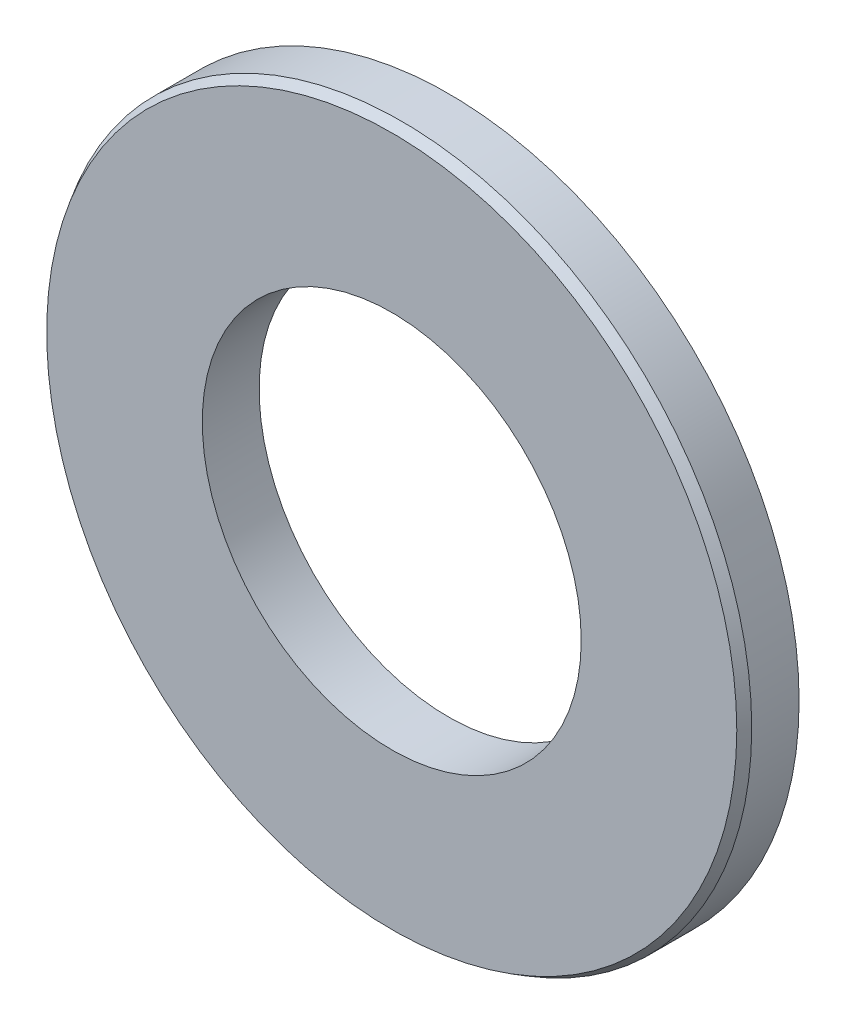
ISO-10303-21;
HEADER;
FILE_DESCRIPTION(('STEP AP214'),'2;1');
FILE_NAME('part.step','',(''),(''),'','','');
FILE_SCHEMA(('AUTOMOTIVE_DESIGN { 1 0 10303 214 1 1 1 1 }'));
ENDSEC;
DATA;
#1=APPLICATION_CONTEXT('core data for automotive mechanical design processes');
#2=APPLICATION_PROTOCOL_DEFINITION('international standard','automotive_design',2000,#1);
#3=PRODUCT_CONTEXT('',#1,'mechanical');
#4=PRODUCT('Part','Part','',(#3));
#5=PRODUCT_RELATED_PRODUCT_CATEGORY('part','',(#4));
#6=PRODUCT_DEFINITION_FORMATION('','',#4);
#7=PRODUCT_DEFINITION_CONTEXT('part definition',#1,'design');
#8=PRODUCT_DEFINITION('design','',#6,#7);
#9=PRODUCT_DEFINITION_SHAPE('','',#8);
#10=(LENGTH_UNIT() NAMED_UNIT(*) SI_UNIT(.MILLI.,.METRE.));
#11=(NAMED_UNIT(*) PLANE_ANGLE_UNIT() SI_UNIT($,.RADIAN.));
#12=(NAMED_UNIT(*) SI_UNIT($,.STERADIAN.) SOLID_ANGLE_UNIT());
#13=UNCERTAINTY_MEASURE_WITH_UNIT(LENGTH_MEASURE(1.E-05),#10,'distance_accuracy_value','');
#14=(GEOMETRIC_REPRESENTATION_CONTEXT(3) GLOBAL_UNCERTAINTY_ASSIGNED_CONTEXT((#13)) GLOBAL_UNIT_ASSIGNED_CONTEXT((#10,
#11,#12)) REPRESENTATION_CONTEXT('',''));
#15=CARTESIAN_POINT('',(0.,0.,0.));
#16=DIRECTION('',(0.,0.,1.));
#17=DIRECTION('',(1.,0.,0.));
#18=AXIS2_PLACEMENT_3D('',#15,#16,#17);
#19=CARTESIAN_POINT('',(0.,0.,3.));
#20=DIRECTION('',(0.,0.,-1.));
#21=DIRECTION('',(-1.,0.,0.));
#22=AXIS2_PLACEMENT_3D('',#19,#20,#21);
#23=CYLINDRICAL_SURFACE('',#22,18.5);
#24=CARTESIAN_POINT('',(0.,0.,2.5));
#25=DIRECTION('',(0.,0.,1.));
#26=DIRECTION('',(1.,0.,0.));
#27=AXIS2_PLACEMENT_3D('',#24,#25,#26);
#28=CIRCLE('',#27,18.5);
#29=CARTESIAN_POINT('',(18.5,0.,2.5));
#30=VERTEX_POINT('',#29);
#31=EDGE_CURVE('E10',#30,#30,#28,.F.);
#32=ORIENTED_EDGE('',*,*,#31,.T.);
#33=EDGE_LOOP('',(#32));
#34=FACE_BOUND('',#33,.T.);
#35=CARTESIAN_POINT('',(0.,0.,0.));
#36=DIRECTION('',(0.,0.,1.));
#37=DIRECTION('',(1.,0.,0.));
#38=AXIS2_PLACEMENT_3D('',#35,#36,#37);
#39=CIRCLE('',#38,18.5);
#40=CARTESIAN_POINT('',(18.5,0.,0.));
#41=VERTEX_POINT('',#40);
#42=EDGE_CURVE('E44',#41,#41,#39,.T.);
#43=ORIENTED_EDGE('',*,*,#42,.T.);
#44=EDGE_LOOP('',(#43));
#45=FACE_BOUND('',#44,.T.);
#46=ADVANCED_FACE('F34',(#34,#45),#23,.T.);
#47=CARTESIAN_POINT('',(0.,0.,3.));
#48=DIRECTION('',(0.,0.,1.));
#49=DIRECTION('',(1.,0.,0.));
#50=AXIS2_PLACEMENT_3D('',#47,#48,#49);
#51=PLANE('',#50);
#52=CARTESIAN_POINT('',(0.,0.,3.));
#53=DIRECTION('',(0.,0.,1.));
#54=DIRECTION('',(1.,0.,0.));
#55=AXIS2_PLACEMENT_3D('',#52,#53,#54);
#56=CIRCLE('',#55,18.2113248654052);
#57=CARTESIAN_POINT('',(18.2113248654052,0.,3.));
#58=VERTEX_POINT('',#57);
#59=EDGE_CURVE('E40',#58,#58,#56,.T.);
#60=ORIENTED_EDGE('',*,*,#59,.T.);
#61=EDGE_LOOP('',(#60));
#62=FACE_BOUND('',#61,.T.);
#63=CARTESIAN_POINT('',(0.,0.,3.));
#64=DIRECTION('',(0.,0.,1.));
#65=DIRECTION('',(1.,0.,0.));
#66=AXIS2_PLACEMENT_3D('',#63,#64,#65);
#67=CIRCLE('',#66,10.);
#68=CARTESIAN_POINT('',(10.,0.,3.));
#69=VERTEX_POINT('',#68);
#70=EDGE_CURVE('E53',#69,#69,#67,.T.);
#71=ORIENTED_EDGE('',*,*,#70,.F.);
#72=EDGE_LOOP('',(#71));
#73=FACE_BOUND('',#72,.T.);
#74=ADVANCED_FACE('F59',(#62,#73),#51,.T.);
#75=CARTESIAN_POINT('',(0.,0.,0.));
#76=DIRECTION('',(0.,0.,1.));
#77=DIRECTION('',(1.,0.,0.));
#78=AXIS2_PLACEMENT_3D('',#75,#76,#77);
#79=PLANE('',#78);
#80=CARTESIAN_POINT('',(0.,0.,0.));
#81=DIRECTION('',(0.,0.,1.));
#82=DIRECTION('',(1.,0.,0.));
#83=AXIS2_PLACEMENT_3D('',#80,#81,#82);
#84=CIRCLE('',#83,10.);
#85=CARTESIAN_POINT('',(10.,0.,0.));
#86=VERTEX_POINT('',#85);
#87=EDGE_CURVE('E48',#86,#86,#84,.T.);
#88=ORIENTED_EDGE('',*,*,#87,.T.);
#89=EDGE_LOOP('',(#88));
#90=FACE_BOUND('',#89,.T.);
#91=ORIENTED_EDGE('',*,*,#42,.F.);
#92=EDGE_LOOP('',(#91));
#93=FACE_BOUND('',#92,.T.);
#94=ADVANCED_FACE('F61',(#90,#93),#79,.F.);
#95=CARTESIAN_POINT('',(0.,0.,0.));
#96=DIRECTION('',(0.,0.,1.));
#97=DIRECTION('',(1.,0.,0.));
#98=AXIS2_PLACEMENT_3D('',#95,#96,#97);
#99=CYLINDRICAL_SURFACE('',#98,10.);
#100=ORIENTED_EDGE('',*,*,#87,.F.);
#101=EDGE_LOOP('',(#100));
#102=FACE_BOUND('',#101,.T.);
#103=ORIENTED_EDGE('',*,*,#70,.T.);
#104=EDGE_LOOP('',(#103));
#105=FACE_BOUND('',#104,.T.);
#106=ADVANCED_FACE('F57',(#102,#105),#99,.F.);
#107=CARTESIAN_POINT('',(0.,0.,3.));
#108=DIRECTION('',(0.,0.,-1.));
#109=DIRECTION('',(-1.,0.,0.));
#110=AXIS2_PLACEMENT_3D('',#107,#108,#109);
#111=CONICAL_SURFACE('',#110,18.2113248654052,0.523598775598295);
#112=ORIENTED_EDGE('',*,*,#31,.F.);
#113=EDGE_LOOP('',(#112));
#114=FACE_BOUND('',#113,.T.);
#115=ORIENTED_EDGE('',*,*,#59,.F.);
#116=EDGE_LOOP('',(#115));
#117=FACE_BOUND('',#116,.T.);
#118=ADVANCED_FACE('F71',(#114,#117),#111,.T.);
#119=CLOSED_SHELL('',(#46,#74,#94,#106,#118));
#120=MANIFOLD_SOLID_BREP('B2',#119);
#121=ADVANCED_BREP_SHAPE_REPRESENTATION('',(#18,#120),#14);
#122=SHAPE_DEFINITION_REPRESENTATION(#9,#121);
ENDSEC;
END-ISO-10303-21;
